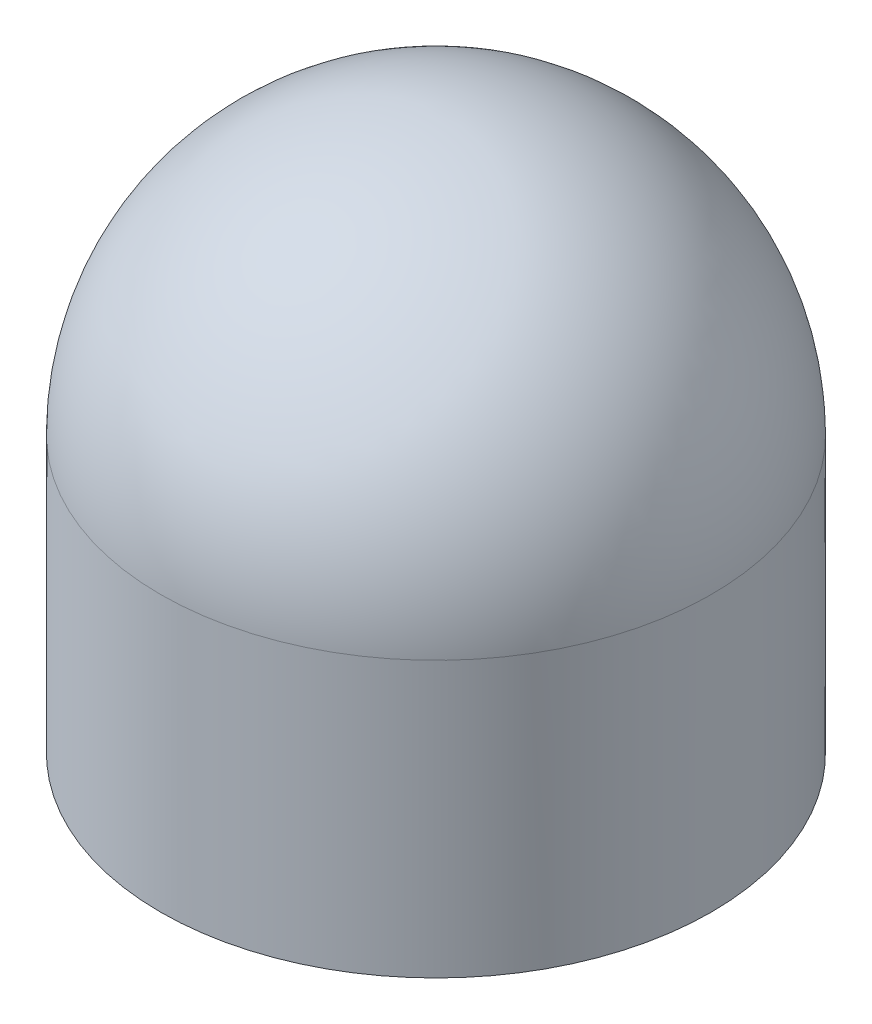
ISO-10303-21;
HEADER;
FILE_DESCRIPTION(('STEP AP214'),'2;1');
FILE_NAME('part.step','',(''),(''),'','','');
FILE_SCHEMA(('AUTOMOTIVE_DESIGN { 1 0 10303 214 1 1 1 1 }'));
ENDSEC;
DATA;
#1=APPLICATION_CONTEXT('core data for automotive mechanical design processes');
#2=APPLICATION_PROTOCOL_DEFINITION('international standard','automotive_design',2000,#1);
#3=PRODUCT_CONTEXT('',#1,'mechanical');
#4=PRODUCT('Part','Part','',(#3));
#5=PRODUCT_RELATED_PRODUCT_CATEGORY('part','',(#4));
#6=PRODUCT_DEFINITION_FORMATION('','',#4);
#7=PRODUCT_DEFINITION_CONTEXT('part definition',#1,'design');
#8=PRODUCT_DEFINITION('design','',#6,#7);
#9=PRODUCT_DEFINITION_SHAPE('','',#8);
#10=(LENGTH_UNIT() NAMED_UNIT(*) SI_UNIT(.MILLI.,.METRE.));
#11=(NAMED_UNIT(*) PLANE_ANGLE_UNIT() SI_UNIT($,.RADIAN.));
#12=(NAMED_UNIT(*) SI_UNIT($,.STERADIAN.) SOLID_ANGLE_UNIT());
#13=UNCERTAINTY_MEASURE_WITH_UNIT(LENGTH_MEASURE(1.E-05),#10,'distance_accuracy_value','');
#14=(GEOMETRIC_REPRESENTATION_CONTEXT(3) GLOBAL_UNCERTAINTY_ASSIGNED_CONTEXT((#13)) GLOBAL_UNIT_ASSIGNED_CONTEXT((#10,
#11,#12)) REPRESENTATION_CONTEXT('',''));
#15=CARTESIAN_POINT('',(0.,0.,0.));
#16=DIRECTION('',(0.,0.,1.));
#17=DIRECTION('',(1.,0.,0.));
#18=AXIS2_PLACEMENT_3D('',#15,#16,#17);
#19=CARTESIAN_POINT('',(0.,0.,0.));
#20=DIRECTION('',(0.,0.,-1.));
#21=DIRECTION('',(-1.,0.,0.));
#22=AXIS2_PLACEMENT_3D('',#19,#20,#21);
#23=SPHERICAL_SURFACE('',#22,25.4351259835503);
#24=CARTESIAN_POINT('',(0.,0.,0.));
#25=DIRECTION('',(0.,-1.,0.));
#26=DIRECTION('',(0.,0.,1.));
#27=AXIS2_PLACEMENT_3D('',#24,#25,#26);
#28=SPHERICAL_SURFACE('',#27,25.4351259835503);
#29=CARTESIAN_POINT('',(0.,0.,0.));
#30=DIRECTION('',(0.,-1.,0.));
#31=DIRECTION('',(0.,0.,1.));
#32=AXIS2_PLACEMENT_3D('',#29,#30,#31);
#33=CIRCLE('',#32,25.4351259835503);
#34=CARTESIAN_POINT('',(0.,0.,25.4351259835503));
#35=VERTEX_POINT('',#34);
#36=EDGE_CURVE('E10',#35,#35,#33,.T.);
#37=ORIENTED_EDGE('',*,*,#36,.F.);
#38=EDGE_LOOP('',(#37));
#39=FACE_BOUND('',#38,.T.);
#40=ADVANCED_FACE('F31',(#39),#28,.T.);
#41=CARTESIAN_POINT('',(1.77367252013231E-13,-25.4,0.));
#42=DIRECTION('',(0.,1.,0.));
#43=DIRECTION('',(-1.,0.,0.));
#44=AXIS2_PLACEMENT_3D('',#41,#42,#43);
#45=CYLINDRICAL_SURFACE('',#44,25.4351259835503);
#46=CARTESIAN_POINT('',(1.77367252013231E-13,-25.4,0.));
#47=DIRECTION('',(0.,-1.,0.));
#48=DIRECTION('',(1.,0.,0.));
#49=AXIS2_PLACEMENT_3D('',#46,#47,#48);
#50=CIRCLE('',#49,25.4351259835503);
#51=CARTESIAN_POINT('',(25.4351259835504,-25.3999999999998,0.));
#52=VERTEX_POINT('',#51);
#53=EDGE_CURVE('E37',#52,#52,#50,.T.);
#54=ORIENTED_EDGE('',*,*,#53,.F.);
#55=EDGE_LOOP('',(#54));
#56=FACE_BOUND('',#55,.T.);
#57=ORIENTED_EDGE('',*,*,#36,.T.);
#58=EDGE_LOOP('',(#57));
#59=FACE_BOUND('',#58,.T.);
#60=ADVANCED_FACE('F45',(#56,#59),#45,.T.);
#61=CARTESIAN_POINT('',(1.77367252013231E-13,-25.4,0.));
#62=DIRECTION('',(0.,-1.,0.));
#63=DIRECTION('',(1.,0.,0.));
#64=AXIS2_PLACEMENT_3D('',#61,#62,#63);
#65=PLANE('',#64);
#66=ORIENTED_EDGE('',*,*,#53,.T.);
#67=EDGE_LOOP('',(#66));
#68=FACE_BOUND('',#67,.T.);
#69=ADVANCED_FACE('F43',(#68),#65,.T.);
#70=CLOSED_SHELL('',(#40,#60,#69));
#71=MANIFOLD_SOLID_BREP('B2',#70);
#72=ADVANCED_BREP_SHAPE_REPRESENTATION('',(#18,#71),#14);
#73=SHAPE_DEFINITION_REPRESENTATION(#9,#72);
ENDSEC;
END-ISO-10303-21;
